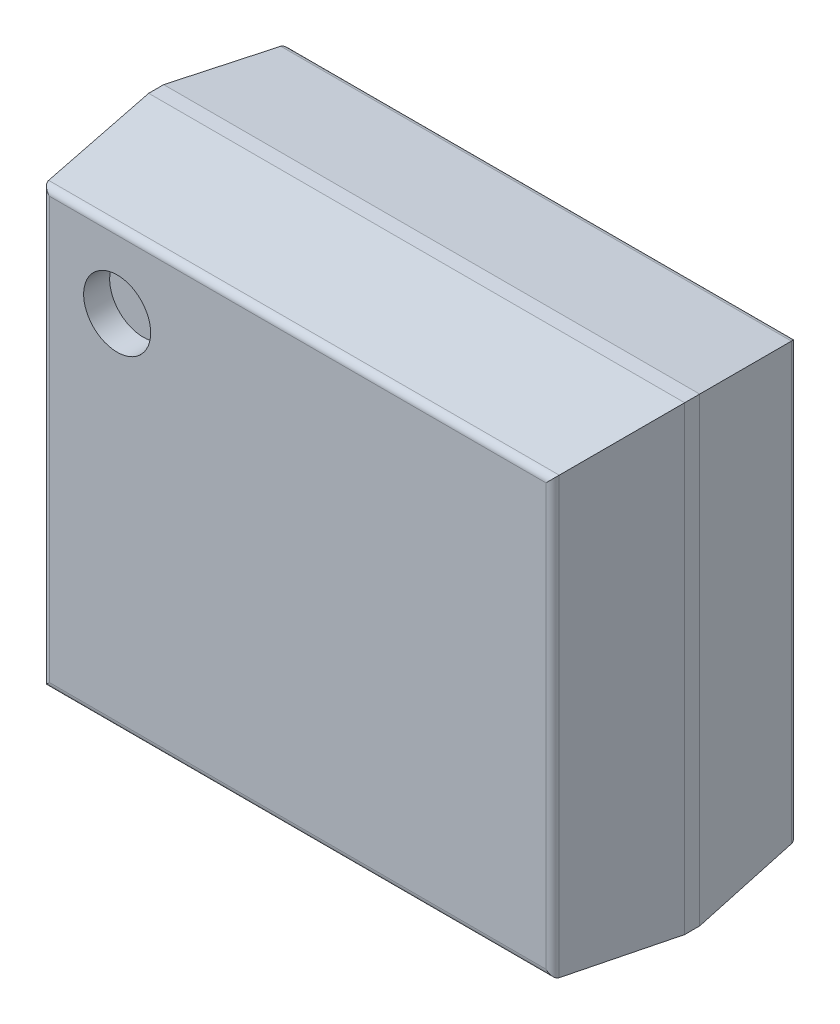
ISO-10303-21;
HEADER;
FILE_DESCRIPTION(('STEP AP214'),'2;1');
FILE_NAME('part.step','',(''),(''),'','','');
FILE_SCHEMA(('AUTOMOTIVE_DESIGN { 1 0 10303 214 1 1 1 1 }'));
ENDSEC;
DATA;
#1=APPLICATION_CONTEXT('core data for automotive mechanical design processes');
#2=APPLICATION_PROTOCOL_DEFINITION('international standard','automotive_design',2000,#1);
#3=PRODUCT_CONTEXT('',#1,'mechanical');
#4=PRODUCT('Part','Part','',(#3));
#5=PRODUCT_RELATED_PRODUCT_CATEGORY('part','',(#4));
#6=PRODUCT_DEFINITION_FORMATION('','',#4);
#7=PRODUCT_DEFINITION_CONTEXT('part definition',#1,'design');
#8=PRODUCT_DEFINITION('design','',#6,#7);
#9=PRODUCT_DEFINITION_SHAPE('','',#8);
#10=(LENGTH_UNIT() NAMED_UNIT(*) SI_UNIT(.MILLI.,.METRE.));
#11=(NAMED_UNIT(*) PLANE_ANGLE_UNIT() SI_UNIT($,.RADIAN.));
#12=(NAMED_UNIT(*) SI_UNIT($,.STERADIAN.) SOLID_ANGLE_UNIT());
#13=UNCERTAINTY_MEASURE_WITH_UNIT(LENGTH_MEASURE(1.E-05),#10,'distance_accuracy_value','');
#14=(GEOMETRIC_REPRESENTATION_CONTEXT(3) GLOBAL_UNCERTAINTY_ASSIGNED_CONTEXT((#13)) GLOBAL_UNIT_ASSIGNED_CONTEXT((#10,
#11,#12)) REPRESENTATION_CONTEXT('',''));
#15=CARTESIAN_POINT('',(0.,0.,0.));
#16=DIRECTION('',(0.,0.,1.));
#17=DIRECTION('',(1.,0.,0.));
#18=AXIS2_PLACEMENT_3D('',#15,#16,#17);
#19=CARTESIAN_POINT('',(-2.29245,1.81395,2.9763));
#20=DIRECTION('',(0.,0.,1.));
#21=DIRECTION('',(1.,0.,0.));
#22=AXIS2_PLACEMENT_3D('',#19,#20,#21);
#23=PLANE('',#22);
#24=CARTESIAN_POINT('',(-2.29245,1.81395,2.9763));
#25=DIRECTION('',(0.,0.,1.));
#26=DIRECTION('',(1.,0.,0.));
#27=AXIS2_PLACEMENT_3D('',#24,#25,#26);
#28=CIRCLE('',#27,0.4254375);
#29=CARTESIAN_POINT('',(-1.8670125,1.81395,2.9763));
#30=VERTEX_POINT('',#29);
#31=EDGE_CURVE('E11',#30,#30,#28,.T.);
#32=ORIENTED_EDGE('',*,*,#31,.T.);
#33=EDGE_LOOP('',(#32));
#34=FACE_BOUND('',#33,.T.);
#35=ADVANCED_FACE('F17',(#34),#23,.T.);
#36=CARTESIAN_POINT('',(-2.29245,1.81395,2.9763));
#37=DIRECTION('',(0.,0.,1.));
#38=DIRECTION('',(1.,0.,0.));
#39=AXIS2_PLACEMENT_3D('',#36,#37,#38);
#40=CYLINDRICAL_SURFACE('',#39,0.4254375);
#41=DIRECTION('',(0.,0.,1.));
#42=VECTOR('',#41,1.);
#43=CARTESIAN_POINT('',(-1.8670125,1.81395,2.9763));
#44=LINE('',#43,#42);
#45=CARTESIAN_POINT('',(-1.8670125,1.81395,3.307));
#46=VERTEX_POINT('',#45);
#47=EDGE_CURVE('E28',#30,#46,#44,.T.);
#48=ORIENTED_EDGE('',*,*,#47,.T.);
#49=CARTESIAN_POINT('',(-2.29245,1.81395,3.307));
#50=DIRECTION('',(0.,0.,1.));
#51=DIRECTION('',(1.,0.,0.));
#52=AXIS2_PLACEMENT_3D('',#49,#50,#51);
#53=CIRCLE('',#52,0.4254375);
#54=EDGE_CURVE('E159',#46,#46,#53,.T.);
#55=ORIENTED_EDGE('',*,*,#54,.T.);
#56=ORIENTED_EDGE('',*,*,#47,.F.);
#57=ORIENTED_EDGE('',*,*,#31,.F.);
#58=EDGE_LOOP('',(#48,#55,#56,#57));
#59=FACE_BOUND('',#58,.T.);
#60=ADVANCED_FACE('F408',(#59),#40,.F.);
#61=CARTESIAN_POINT('',(3.152888701606,-2.754825,3.217));
#62=DIRECTION('',(0.,1.,0.));
#63=DIRECTION('',(0.,0.,1.));
#64=AXIS2_PLACEMENT_3D('',#61,#62,#63);
#65=CYLINDRICAL_SURFACE('',#64,0.09);
#66=CARTESIAN_POINT('',(3.152888701606,-2.674388701606,3.217));
#67=DIRECTION('',(-0.707106781186548,-0.707106781186548,0.));
#68=DIRECTION('',(0.707106781186548,-0.707106781186548,0.));
#69=AXIS2_PLACEMENT_3D('',#66,#67,#68);
#70=ELLIPSE('',#69,0.127279220614,0.09);
#71=CARTESIAN_POINT('',(3.242323719037,-2.763823719037,3.227068647234));
#72=VERTEX_POINT('',#71);
#73=CARTESIAN_POINT('',(3.152888701606,-2.674388701606,3.307));
#74=VERTEX_POINT('',#73);
#75=EDGE_CURVE('E166',#72,#74,#70,.T.);
#76=ORIENTED_EDGE('',*,*,#75,.F.);
#77=DIRECTION('',(0.,1.,0.));
#78=VECTOR('',#77,1.);
#79=CARTESIAN_POINT('',(3.242323719037,-2.754825,3.227068647234));
#80=LINE('',#79,#78);
#81=CARTESIAN_POINT('',(3.242323719037,2.763823719037,3.227068647234));
#82=VERTEX_POINT('',#81);
#83=EDGE_CURVE('E162',#72,#82,#80,.T.);
#84=ORIENTED_EDGE('',*,*,#83,.T.);
#85=CARTESIAN_POINT('',(3.152888701606,2.674388701606,3.217));
#86=DIRECTION('',(-0.707106781186548,0.707106781186548,0.));
#87=DIRECTION('',(0.707106781186548,0.707106781186548,0.));
#88=AXIS2_PLACEMENT_3D('',#85,#86,#87);
#89=ELLIPSE('',#88,0.127279220614,0.09);
#90=CARTESIAN_POINT('',(3.152888701606,2.674388701606,3.307));
#91=VERTEX_POINT('',#90);
#92=EDGE_CURVE('E149',#91,#82,#89,.T.);
#93=ORIENTED_EDGE('',*,*,#92,.F.);
#94=DIRECTION('',(0.,1.,0.));
#95=VECTOR('',#94,1.);
#96=CARTESIAN_POINT('',(3.152888701606,-2.754825,3.307));
#97=LINE('',#96,#95);
#98=EDGE_CURVE('E196',#74,#91,#97,.T.);
#99=ORIENTED_EDGE('',*,*,#98,.F.);
#100=EDGE_LOOP('',(#76,#84,#93,#99));
#101=FACE_BOUND('',#100,.T.);
#102=ADVANCED_FACE('F164',(#101),#65,.T.);
#103=CARTESIAN_POINT('',(-3.233325,2.674388701606,3.217));
#104=DIRECTION('',(1.,0.,0.));
#105=DIRECTION('',(0.,0.,1.));
#106=AXIS2_PLACEMENT_3D('',#103,#104,#105);
#107=CYLINDRICAL_SURFACE('',#106,0.09);
#108=DIRECTION('',(1.,0.,0.));
#109=VECTOR('',#108,1.);
#110=CARTESIAN_POINT('',(-3.233325,2.674388701606,3.307));
#111=LINE('',#110,#109);
#112=CARTESIAN_POINT('',(-3.152888701606,2.674388701606,3.307));
#113=VERTEX_POINT('',#112);
#114=EDGE_CURVE('E21',#113,#91,#111,.T.);
#115=ORIENTED_EDGE('',*,*,#114,.T.);
#116=ORIENTED_EDGE('',*,*,#92,.T.);
#117=DIRECTION('',(1.,0.,0.));
#118=VECTOR('',#117,1.);
#119=CARTESIAN_POINT('',(-3.233325,2.763823719037,3.227068647234));
#120=LINE('',#119,#118);
#121=CARTESIAN_POINT('',(-3.242323719037,2.763823719037,3.227068647234));
#122=VERTEX_POINT('',#121);
#123=EDGE_CURVE('E154',#122,#82,#120,.T.);
#124=ORIENTED_EDGE('',*,*,#123,.F.);
#125=CARTESIAN_POINT('',(-3.152888701606,2.674388701606,3.217));
#126=DIRECTION('',(0.707106781186548,0.707106781186548,0.));
#127=DIRECTION('',(-0.707106781186548,0.707106781186548,0.));
#128=AXIS2_PLACEMENT_3D('',#125,#126,#127);
#129=ELLIPSE('',#128,0.127279220614,0.09);
#130=EDGE_CURVE('E185',#122,#113,#129,.T.);
#131=ORIENTED_EDGE('',*,*,#130,.T.);
#132=EDGE_LOOP('',(#115,#116,#124,#131));
#133=FACE_BOUND('',#132,.T.);
#134=ADVANCED_FACE('F151',(#133),#107,.T.);
#135=CARTESIAN_POINT('',(-3.4035,-2.925,3.307));
#136=DIRECTION('',(0.,0.,1.));
#137=DIRECTION('',(1.,0.,0.));
#138=AXIS2_PLACEMENT_3D('',#135,#136,#137);
#139=PLANE('',#138);
#140=ORIENTED_EDGE('',*,*,#54,.F.);
#141=EDGE_LOOP('',(#140));
#142=FACE_BOUND('',#141,.T.);
#143=DIRECTION('',(0.,1.,0.));
#144=VECTOR('',#143,1.);
#145=CARTESIAN_POINT('',(-3.152888701606,-2.754825,3.307));
#146=LINE('',#145,#144);
#147=CARTESIAN_POINT('',(-3.152888701606,-2.674388701606,3.307));
#148=VERTEX_POINT('',#147);
#149=EDGE_CURVE('E191',#148,#113,#146,.T.);
#150=ORIENTED_EDGE('',*,*,#149,.F.);
#151=DIRECTION('',(1.,0.,0.));
#152=VECTOR('',#151,1.);
#153=CARTESIAN_POINT('',(-3.233325,-2.674388701606,3.307));
#154=LINE('',#153,#152);
#155=EDGE_CURVE('E198',#148,#74,#154,.T.);
#156=ORIENTED_EDGE('',*,*,#155,.T.);
#157=ORIENTED_EDGE('',*,*,#98,.T.);
#158=ORIENTED_EDGE('',*,*,#114,.F.);
#159=EDGE_LOOP('',(#150,#156,#157,#158));
#160=FACE_BOUND('',#159,.T.);
#161=ADVANCED_FACE('F388',(#142,#160),#139,.T.);
#162=CARTESIAN_POINT('',(-3.233325,-2.674388701606,3.217));
#163=DIRECTION('',(1.,0.,0.));
#164=DIRECTION('',(0.,-0.993722415899916,0.11187385815299));
#165=AXIS2_PLACEMENT_3D('',#162,#163,#164);
#166=CYLINDRICAL_SURFACE('',#165,0.09);
#167=DIRECTION('',(1.,0.,0.));
#168=VECTOR('',#167,1.);
#169=CARTESIAN_POINT('',(-3.233325,-2.763823719037,3.227068647234));
#170=LINE('',#169,#168);
#171=CARTESIAN_POINT('',(-3.242323719037,-2.763823719037,3.227068647234));
#172=VERTEX_POINT('',#171);
#173=EDGE_CURVE('E249',#172,#72,#170,.T.);
#174=ORIENTED_EDGE('',*,*,#173,.T.);
#175=ORIENTED_EDGE('',*,*,#75,.T.);
#176=ORIENTED_EDGE('',*,*,#155,.F.);
#177=CARTESIAN_POINT('',(-3.152888701606,-2.674388701606,3.217));
#178=DIRECTION('',(-0.707106781186548,0.707106781186548,0.));
#179=DIRECTION('',(0.707106781186548,0.707106781186548,0.));
#180=AXIS2_PLACEMENT_3D('',#177,#178,#179);
#181=ELLIPSE('',#180,0.127279220614,0.09);
#182=EDGE_CURVE('E251',#172,#148,#181,.T.);
#183=ORIENTED_EDGE('',*,*,#182,.F.);
#184=EDGE_LOOP('',(#174,#175,#176,#183));
#185=FACE_BOUND('',#184,.T.);
#186=ADVANCED_FACE('F385',(#185),#166,.T.);
#187=CARTESIAN_POINT('',(3.3184125,-2.925,2.551208097772));
#188=DIRECTION('',(0.993722415899916,0.,0.11187385815299));
#189=DIRECTION('',(0.,-1.,0.));
#190=AXIS2_PLACEMENT_3D('',#187,#188,#189);
#191=PLANE('',#190);
#192=DIRECTION('',(-0.111180268816051,0.111180268816051,0.987561590814457));
#193=VECTOR('',#192,1.);
#194=CARTESIAN_POINT('',(3.277393429953,-2.798893429953,2.915561040079));
#195=LINE('',#194,#193);
#196=CARTESIAN_POINT('',(3.4035,-2.925,1.795416195544));
#197=VERTEX_POINT('',#196);
#198=EDGE_CURVE('E225',#197,#72,#195,.T.);
#199=ORIENTED_EDGE('',*,*,#198,.F.);
#200=DIRECTION('',(0.,1.,0.));
#201=VECTOR('',#200,1.);
#202=CARTESIAN_POINT('',(3.4035,-2.925,1.795416195544));
#203=LINE('',#202,#201);
#204=CARTESIAN_POINT('',(3.4035,2.925,1.795416195544));
#205=VERTEX_POINT('',#204);
#206=EDGE_CURVE('E174',#197,#205,#203,.T.);
#207=ORIENTED_EDGE('',*,*,#206,.T.);
#208=DIRECTION('',(-0.111180268816051,-0.111180268816051,0.987561590814457));
#209=VECTOR('',#208,1.);
#210=CARTESIAN_POINT('',(3.241237352344,2.762737352344,3.23671832726));
#211=LINE('',#210,#209);
#212=EDGE_CURVE('E170',#205,#82,#211,.T.);
#213=ORIENTED_EDGE('',*,*,#212,.T.);
#214=ORIENTED_EDGE('',*,*,#83,.F.);
#215=EDGE_LOOP('',(#199,#207,#213,#214));
#216=FACE_BOUND('',#215,.T.);
#217=ADVANCED_FACE('F19',(#216),#191,.T.);
#218=CARTESIAN_POINT('',(-3.4035,2.8399125,2.551208097772));
#219=DIRECTION('',(0.,0.993722415899916,0.11187385815299));
#220=DIRECTION('',(1.,0.,0.));
#221=AXIS2_PLACEMENT_3D('',#218,#219,#220);
#222=PLANE('',#221);
#223=ORIENTED_EDGE('',*,*,#123,.T.);
#224=ORIENTED_EDGE('',*,*,#212,.F.);
#225=DIRECTION('',(1.,0.,0.));
#226=VECTOR('',#225,1.);
#227=CARTESIAN_POINT('',(-3.4035,2.925,1.795416195544));
#228=LINE('',#227,#226);
#229=CARTESIAN_POINT('',(-3.4035,2.925,1.795416195544));
#230=VERTEX_POINT('',#229);
#231=EDGE_CURVE('E265',#230,#205,#228,.T.);
#232=ORIENTED_EDGE('',*,*,#231,.F.);
#233=DIRECTION('',(0.111180268816051,-0.111180268816051,0.987561590814457));
#234=VECTOR('',#233,1.);
#235=CARTESIAN_POINT('',(-3.283308193418,2.804808193418,2.863023001817));
#236=LINE('',#235,#234);
#237=EDGE_CURVE('E182',#230,#122,#236,.T.);
#238=ORIENTED_EDGE('',*,*,#237,.T.);
#239=EDGE_LOOP('',(#223,#224,#232,#238));
#240=FACE_BOUND('',#239,.T.);
#241=ADVANCED_FACE('F180',(#240),#222,.T.);
#242=CARTESIAN_POINT('',(-3.152888701606,-2.754825,3.217));
#243=DIRECTION('',(0.,1.,0.));
#244=DIRECTION('',(-0.993722415899916,0.,0.11187385815299));
#245=AXIS2_PLACEMENT_3D('',#242,#243,#244);
#246=CYLINDRICAL_SURFACE('',#245,0.09);
#247=ORIENTED_EDGE('',*,*,#182,.T.);
#248=ORIENTED_EDGE('',*,*,#149,.T.);
#249=ORIENTED_EDGE('',*,*,#130,.F.);
#250=DIRECTION('',(0.,1.,0.));
#251=VECTOR('',#250,1.);
#252=CARTESIAN_POINT('',(-3.242323719037,-2.754825,3.227068647234));
#253=LINE('',#252,#251);
#254=EDGE_CURVE('E280',#172,#122,#253,.T.);
#255=ORIENTED_EDGE('',*,*,#254,.F.);
#256=EDGE_LOOP('',(#247,#248,#249,#255));
#257=FACE_BOUND('',#256,.T.);
#258=ADVANCED_FACE('F390',(#257),#246,.T.);
#259=CARTESIAN_POINT('',(-3.4035,-2.8399125,2.551208097772));
#260=DIRECTION('',(0.,0.993722415899916,-0.11187385815299));
#261=DIRECTION('',(-1.,0.,0.));
#262=AXIS2_PLACEMENT_3D('',#259,#260,#261);
#263=PLANE('',#262);
#264=DIRECTION('',(0.111180268816051,0.111180268816051,0.987561590814457));
#265=VECTOR('',#264,1.);
#266=CARTESIAN_POINT('',(-3.319464271027,-2.840964271027,2.541865714636));
#267=LINE('',#266,#265);
#268=CARTESIAN_POINT('',(-3.4035,-2.925,1.795416195544));
#269=VERTEX_POINT('',#268);
#270=EDGE_CURVE('E298',#269,#172,#267,.T.);
#271=ORIENTED_EDGE('',*,*,#270,.F.);
#272=DIRECTION('',(1.,0.,0.));
#273=VECTOR('',#272,1.);
#274=CARTESIAN_POINT('',(-3.4035,-2.925,1.795416195544));
#275=LINE('',#274,#273);
#276=EDGE_CURVE('E305',#269,#197,#275,.T.);
#277=ORIENTED_EDGE('',*,*,#276,.T.);
#278=ORIENTED_EDGE('',*,*,#198,.T.);
#279=ORIENTED_EDGE('',*,*,#173,.F.);
#280=EDGE_LOOP('',(#271,#277,#278,#279));
#281=FACE_BOUND('',#280,.T.);
#282=ADVANCED_FACE('F396',(#281),#263,.F.);
#283=CARTESIAN_POINT('',(3.4035,-2.925,0.2));
#284=DIRECTION('',(1.,0.,0.));
#285=DIRECTION('',(0.,1.,0.));
#286=AXIS2_PLACEMENT_3D('',#283,#284,#285);
#287=PLANE('',#286);
#288=DIRECTION('',(0.,0.,1.));
#289=VECTOR('',#288,1.);
#290=CARTESIAN_POINT('',(3.4035,-2.925,0.2));
#291=LINE('',#290,#289);
#292=CARTESIAN_POINT('',(3.4035,-2.925,1.604916195544));
#293=VERTEX_POINT('',#292);
#294=EDGE_CURVE('E291',#293,#197,#291,.T.);
#295=ORIENTED_EDGE('',*,*,#294,.F.);
#296=DIRECTION('',(0.,1.,0.));
#297=VECTOR('',#296,1.);
#298=CARTESIAN_POINT('',(3.4035,-2.925,1.604916195544));
#299=LINE('',#298,#297);
#300=CARTESIAN_POINT('',(3.4035,2.925,1.604916195544));
#301=VERTEX_POINT('',#300);
#302=EDGE_CURVE('E290',#293,#301,#299,.T.);
#303=ORIENTED_EDGE('',*,*,#302,.T.);
#304=DIRECTION('',(0.,0.,1.));
#305=VECTOR('',#304,1.);
#306=CARTESIAN_POINT('',(3.4035,2.925,0.2));
#307=LINE('',#306,#305);
#308=EDGE_CURVE('E271',#301,#205,#307,.T.);
#309=ORIENTED_EDGE('',*,*,#308,.T.);
#310=ORIENTED_EDGE('',*,*,#206,.F.);
#311=EDGE_LOOP('',(#295,#303,#309,#310));
#312=FACE_BOUND('',#311,.T.);
#313=ADVANCED_FACE('F374',(#312),#287,.T.);
#314=CARTESIAN_POINT('',(3.153568702027,-2.754825,0.29));
#315=DIRECTION('',(0.,1.,0.));
#316=DIRECTION('',(0.,0.,-1.));
#317=AXIS2_PLACEMENT_3D('',#314,#315,#316);
#318=CYLINDRICAL_SURFACE('',#317,0.09);
#319=DIRECTION('',(0.,1.,0.));
#320=VECTOR('',#319,1.);
#321=CARTESIAN_POINT('',(3.153568702027,-2.754825,0.2));
#322=LINE('',#321,#320);
#323=CARTESIAN_POINT('',(3.153568702027,-2.675068702027,0.2));
#324=VERTEX_POINT('',#323);
#325=CARTESIAN_POINT('',(3.153568702027,2.675068702027,0.2));
#326=VERTEX_POINT('',#325);
#327=EDGE_CURVE('E293',#324,#326,#322,.T.);
#328=ORIENTED_EDGE('',*,*,#327,.T.);
#329=CARTESIAN_POINT('',(3.153568702027,2.675068702027,0.29));
#330=DIRECTION('',(0.707106781186548,-0.707106781186548,0.));
#331=DIRECTION('',(0.707106781186548,0.707106781186548,0.));
#332=AXIS2_PLACEMENT_3D('',#329,#330,#331);
#333=ELLIPSE('',#332,0.127279220614,0.09);
#334=CARTESIAN_POINT('',(3.242915637577,2.764415637577,0.279177564608));
#335=VERTEX_POINT('',#334);
#336=EDGE_CURVE('E283',#326,#335,#333,.T.);
#337=ORIENTED_EDGE('',*,*,#336,.T.);
#338=DIRECTION('',(0.,1.,0.));
#339=VECTOR('',#338,1.);
#340=CARTESIAN_POINT('',(3.242915637577,-2.754825,0.279177564608));
#341=LINE('',#340,#339);
#342=CARTESIAN_POINT('',(3.242915637577,-2.764415637577,0.279177564608));
#343=VERTEX_POINT('',#342);
#344=EDGE_CURVE('E287',#343,#335,#341,.T.);
#345=ORIENTED_EDGE('',*,*,#344,.F.);
#346=CARTESIAN_POINT('',(3.153568702027,-2.675068702027,0.29));
#347=DIRECTION('',(0.707106781186548,0.707106781186548,0.));
#348=DIRECTION('',(0.707106781186548,-0.707106781186548,0.));
#349=AXIS2_PLACEMENT_3D('',#346,#347,#348);
#350=ELLIPSE('',#349,0.127279220614,0.09);
#351=EDGE_CURVE('E311',#343,#324,#350,.T.);
#352=ORIENTED_EDGE('',*,*,#351,.T.);
#353=EDGE_LOOP('',(#328,#337,#345,#352));
#354=FACE_BOUND('',#353,.T.);
#355=ADVANCED_FACE('F362',(#354),#318,.T.);
#356=CARTESIAN_POINT('',(-3.4035,2.925,0.2));
#357=DIRECTION('',(0.,1.,0.));
#358=DIRECTION('',(1.,0.,0.));
#359=AXIS2_PLACEMENT_3D('',#356,#357,#358);
#360=PLANE('',#359);
#361=ORIENTED_EDGE('',*,*,#308,.F.);
#362=DIRECTION('',(1.,0.,0.));
#363=VECTOR('',#362,1.);
#364=CARTESIAN_POINT('',(-3.4035,2.925,1.604916195544));
#365=LINE('',#364,#363);
#366=CARTESIAN_POINT('',(-3.4035,2.925,1.604916195544));
#367=VERTEX_POINT('',#366);
#368=EDGE_CURVE('E104',#367,#301,#365,.T.);
#369=ORIENTED_EDGE('',*,*,#368,.F.);
#370=DIRECTION('',(0.,0.,1.));
#371=VECTOR('',#370,1.);
#372=CARTESIAN_POINT('',(-3.4035,2.925,0.2));
#373=LINE('',#372,#371);
#374=EDGE_CURVE('E204',#367,#230,#373,.T.);
#375=ORIENTED_EDGE('',*,*,#374,.T.);
#376=ORIENTED_EDGE('',*,*,#231,.T.);
#377=EDGE_LOOP('',(#361,#369,#375,#376));
#378=FACE_BOUND('',#377,.T.);
#379=ADVANCED_FACE('F372',(#378),#360,.T.);
#380=CARTESIAN_POINT('',(-3.3184125,-2.925,2.551208097772));
#381=DIRECTION('',(0.993722415899916,0.,-0.11187385815299));
#382=DIRECTION('',(0.,-1.,0.));
#383=AXIS2_PLACEMENT_3D('',#380,#381,#382);
#384=PLANE('',#383);
#385=ORIENTED_EDGE('',*,*,#254,.T.);
#386=ORIENTED_EDGE('',*,*,#237,.F.);
#387=DIRECTION('',(0.,1.,0.));
#388=VECTOR('',#387,1.);
#389=CARTESIAN_POINT('',(-3.4035,-2.925,1.795416195544));
#390=LINE('',#389,#388);
#391=EDGE_CURVE('E215',#269,#230,#390,.T.);
#392=ORIENTED_EDGE('',*,*,#391,.F.);
#393=ORIENTED_EDGE('',*,*,#270,.T.);
#394=EDGE_LOOP('',(#385,#386,#392,#393));
#395=FACE_BOUND('',#394,.T.);
#396=ADVANCED_FACE('F378',(#395),#384,.F.);
#397=CARTESIAN_POINT('',(-3.233325,2.675068702027,0.29));
#398=DIRECTION('',(1.,0.,0.));
#399=DIRECTION('',(0.,0.,-1.));
#400=AXIS2_PLACEMENT_3D('',#397,#398,#399);
#401=CYLINDRICAL_SURFACE('',#400,0.09);
#402=CARTESIAN_POINT('',(-3.153568702027,2.675068702027,0.29));
#403=DIRECTION('',(-0.707106781186548,-0.707106781186548,0.));
#404=DIRECTION('',(-0.707106781186548,0.707106781186548,0.));
#405=AXIS2_PLACEMENT_3D('',#402,#403,#404);
#406=ELLIPSE('',#405,0.127279220614,0.09);
#407=CARTESIAN_POINT('',(-3.242915637577,2.764415637577,0.279177564608));
#408=VERTEX_POINT('',#407);
#409=CARTESIAN_POINT('',(-3.153568702027,2.675068702027,0.2));
#410=VERTEX_POINT('',#409);
#411=EDGE_CURVE('E241',#408,#410,#406,.T.);
#412=ORIENTED_EDGE('',*,*,#411,.F.);
#413=DIRECTION('',(1.,0.,0.));
#414=VECTOR('',#413,1.);
#415=CARTESIAN_POINT('',(-3.233325,2.764415637577,0.279177564608));
#416=LINE('',#415,#414);
#417=EDGE_CURVE('E92',#408,#335,#416,.T.);
#418=ORIENTED_EDGE('',*,*,#417,.T.);
#419=ORIENTED_EDGE('',*,*,#336,.F.);
#420=DIRECTION('',(1.,0.,0.));
#421=VECTOR('',#420,1.);
#422=CARTESIAN_POINT('',(-3.233325,2.675068702027,0.2));
#423=LINE('',#422,#421);
#424=EDGE_CURVE('E297',#410,#326,#423,.T.);
#425=ORIENTED_EDGE('',*,*,#424,.F.);
#426=EDGE_LOOP('',(#412,#418,#419,#425));
#427=FACE_BOUND('',#426,.T.);
#428=ADVANCED_FACE('F367',(#427),#401,.T.);
#429=CARTESIAN_POINT('',(-3.4035,-2.925,0.2));
#430=DIRECTION('',(0.,0.,1.));
#431=DIRECTION('',(1.,0.,0.));
#432=AXIS2_PLACEMENT_3D('',#429,#430,#431);
#433=PLANE('',#432);
#434=ORIENTED_EDGE('',*,*,#424,.T.);
#435=ORIENTED_EDGE('',*,*,#327,.F.);
#436=DIRECTION('',(1.,0.,0.));
#437=VECTOR('',#436,1.);
#438=CARTESIAN_POINT('',(-3.233325,-2.675068702027,0.2));
#439=LINE('',#438,#437);
#440=CARTESIAN_POINT('',(-3.153568702027,-2.675068702027,0.2));
#441=VERTEX_POINT('',#440);
#442=EDGE_CURVE('E316',#441,#324,#439,.T.);
#443=ORIENTED_EDGE('',*,*,#442,.F.);
#444=DIRECTION('',(0.,1.,0.));
#445=VECTOR('',#444,1.);
#446=CARTESIAN_POINT('',(-3.153568702027,-2.754825,0.2));
#447=LINE('',#446,#445);
#448=EDGE_CURVE('E237',#441,#410,#447,.T.);
#449=ORIENTED_EDGE('',*,*,#448,.T.);
#450=EDGE_LOOP('',(#434,#435,#443,#449));
#451=FACE_BOUND('',#450,.T.);
#452=ADVANCED_FACE('F360',(#451),#433,.F.);
#453=CARTESIAN_POINT('',(3.3184125,-2.925,0.902458097772));
#454=DIRECTION('',(-0.992743728334123,0.,0.120249282132015));
#455=DIRECTION('',(0.,1.,0.));
#456=AXIS2_PLACEMENT_3D('',#453,#454,#455);
#457=PLANE('',#456);
#458=ORIENTED_EDGE('',*,*,#344,.T.);
#459=DIRECTION('',(-0.119389202775043,-0.119389202775043,-0.985643158816354));
#460=VECTOR('',#459,1.);
#461=CARTESIAN_POINT('',(3.229420260917,2.750920260917,0.167763589381));
#462=LINE('',#461,#460);
#463=EDGE_CURVE('E212',#301,#335,#462,.T.);
#464=ORIENTED_EDGE('',*,*,#463,.F.);
#465=ORIENTED_EDGE('',*,*,#302,.F.);
#466=DIRECTION('',(-0.119389202775043,0.119389202775043,-0.985643158816354));
#467=VECTOR('',#466,1.);
#468=CARTESIAN_POINT('',(3.271112572504,-2.792612572504,0.511963405915));
#469=LINE('',#468,#467);
#470=EDGE_CURVE('E279',#293,#343,#469,.T.);
#471=ORIENTED_EDGE('',*,*,#470,.T.);
#472=EDGE_LOOP('',(#458,#464,#465,#471));
#473=FACE_BOUND('',#472,.T.);
#474=ADVANCED_FACE('F365',(#473),#457,.F.);
#475=CARTESIAN_POINT('',(-3.4035,-2.925,0.2));
#476=DIRECTION('',(0.,1.,0.));
#477=DIRECTION('',(1.,0.,0.));
#478=AXIS2_PLACEMENT_3D('',#475,#476,#477);
#479=PLANE('',#478);
#480=ORIENTED_EDGE('',*,*,#276,.F.);
#481=DIRECTION('',(0.,0.,1.));
#482=VECTOR('',#481,1.);
#483=CARTESIAN_POINT('',(-3.4035,-2.925,0.2));
#484=LINE('',#483,#482);
#485=CARTESIAN_POINT('',(-3.4035,-2.925,1.604916195544));
#486=VERTEX_POINT('',#485);
#487=EDGE_CURVE('E201',#486,#269,#484,.T.);
#488=ORIENTED_EDGE('',*,*,#487,.F.);
#489=DIRECTION('',(1.,0.,0.));
#490=VECTOR('',#489,1.);
#491=CARTESIAN_POINT('',(-3.4035,-2.925,1.604916195544));
#492=LINE('',#491,#490);
#493=EDGE_CURVE('E276',#486,#293,#492,.T.);
#494=ORIENTED_EDGE('',*,*,#493,.T.);
#495=ORIENTED_EDGE('',*,*,#294,.T.);
#496=EDGE_LOOP('',(#480,#488,#494,#495));
#497=FACE_BOUND('',#496,.T.);
#498=ADVANCED_FACE('F375',(#497),#479,.F.);
#499=CARTESIAN_POINT('',(-3.233325,-2.675068702027,0.29));
#500=DIRECTION('',(1.,0.,0.));
#501=DIRECTION('',(0.,-0.992743728334123,-0.120249282132015));
#502=AXIS2_PLACEMENT_3D('',#499,#500,#501);
#503=CYLINDRICAL_SURFACE('',#502,0.09);
#504=CARTESIAN_POINT('',(-3.153568702027,-2.675068702027,0.29));
#505=DIRECTION('',(0.707106781186548,-0.707106781186548,0.));
#506=DIRECTION('',(0.707106781186548,0.707106781186548,0.));
#507=AXIS2_PLACEMENT_3D('',#504,#505,#506);
#508=ELLIPSE('',#507,0.127279220614,0.09);
#509=CARTESIAN_POINT('',(-3.242915637577,-2.764415637577,0.279177564608));
#510=VERTEX_POINT('',#509);
#511=EDGE_CURVE('E221',#510,#441,#508,.T.);
#512=ORIENTED_EDGE('',*,*,#511,.T.);
#513=ORIENTED_EDGE('',*,*,#442,.T.);
#514=ORIENTED_EDGE('',*,*,#351,.F.);
#515=DIRECTION('',(1.,0.,0.));
#516=VECTOR('',#515,1.);
#517=CARTESIAN_POINT('',(-3.233325,-2.764415637577,0.279177564608));
#518=LINE('',#517,#516);
#519=EDGE_CURVE('E248',#510,#343,#518,.T.);
#520=ORIENTED_EDGE('',*,*,#519,.F.);
#521=EDGE_LOOP('',(#512,#513,#514,#520));
#522=FACE_BOUND('',#521,.T.);
#523=ADVANCED_FACE('F353',(#522),#503,.T.);
#524=CARTESIAN_POINT('',(-3.4035,2.8399125,0.902458097772));
#525=DIRECTION('',(0.,-0.992743728334123,0.120249282132015));
#526=DIRECTION('',(-1.,0.,0.));
#527=AXIS2_PLACEMENT_3D('',#524,#525,#526);
#528=PLANE('',#527);
#529=DIRECTION('',(0.119389202775043,-0.119389202775043,-0.985643158816354));
#530=VECTOR('',#529,1.);
#531=CARTESIAN_POINT('',(-3.277933007066,2.799433007066,0.568270965645));
#532=LINE('',#531,#530);
#533=EDGE_CURVE('E228',#367,#408,#532,.T.);
#534=ORIENTED_EDGE('',*,*,#533,.F.);
#535=ORIENTED_EDGE('',*,*,#368,.T.);
#536=ORIENTED_EDGE('',*,*,#463,.T.);
#537=ORIENTED_EDGE('',*,*,#417,.F.);
#538=EDGE_LOOP('',(#534,#535,#536,#537));
#539=FACE_BOUND('',#538,.T.);
#540=ADVANCED_FACE('F368',(#539),#528,.F.);
#541=CARTESIAN_POINT('',(-3.4035,-2.925,0.2));
#542=DIRECTION('',(1.,0.,0.));
#543=DIRECTION('',(0.,1.,0.));
#544=AXIS2_PLACEMENT_3D('',#541,#542,#543);
#545=PLANE('',#544);
#546=ORIENTED_EDGE('',*,*,#391,.T.);
#547=ORIENTED_EDGE('',*,*,#374,.F.);
#548=DIRECTION('',(0.,1.,0.));
#549=VECTOR('',#548,1.);
#550=CARTESIAN_POINT('',(-3.4035,-2.925,1.604916195544));
#551=LINE('',#550,#549);
#552=EDGE_CURVE('E233',#486,#367,#551,.T.);
#553=ORIENTED_EDGE('',*,*,#552,.F.);
#554=ORIENTED_EDGE('',*,*,#487,.T.);
#555=EDGE_LOOP('',(#546,#547,#553,#554));
#556=FACE_BOUND('',#555,.T.);
#557=ADVANCED_FACE('F376',(#556),#545,.F.);
#558=CARTESIAN_POINT('',(-3.153568702027,-2.754825,0.29));
#559=DIRECTION('',(0.,1.,0.));
#560=DIRECTION('',(-0.992743728334123,0.,-0.120249282132015));
#561=AXIS2_PLACEMENT_3D('',#558,#559,#560);
#562=CYLINDRICAL_SURFACE('',#561,0.09);
#563=DIRECTION('',(0.,1.,0.));
#564=VECTOR('',#563,1.);
#565=CARTESIAN_POINT('',(-3.242915637577,-2.754825,0.279177564608));
#566=LINE('',#565,#564);
#567=EDGE_CURVE('E232',#510,#408,#566,.T.);
#568=ORIENTED_EDGE('',*,*,#567,.T.);
#569=ORIENTED_EDGE('',*,*,#411,.T.);
#570=ORIENTED_EDGE('',*,*,#448,.F.);
#571=ORIENTED_EDGE('',*,*,#511,.F.);
#572=EDGE_LOOP('',(#568,#569,#570,#571));
#573=FACE_BOUND('',#572,.T.);
#574=ADVANCED_FACE('F358',(#573),#562,.T.);
#575=CARTESIAN_POINT('',(-3.4035,-2.8399125,0.902458097772));
#576=DIRECTION('',(0.,-0.992743728334123,-0.120249282132015));
#577=DIRECTION('',(0.,0.120249282132015,-0.992743728334123));
#578=AXIS2_PLACEMENT_3D('',#575,#576,#577);
#579=PLANE('',#578);
#580=ORIENTED_EDGE('',*,*,#519,.T.);
#581=ORIENTED_EDGE('',*,*,#470,.F.);
#582=ORIENTED_EDGE('',*,*,#493,.F.);
#583=DIRECTION('',(0.119389202775043,0.119389202775043,-0.985643158816354));
#584=VECTOR('',#583,1.);
#585=CARTESIAN_POINT('',(-3.319625318654,-2.841125318654,0.912470782179));
#586=LINE('',#585,#584);
#587=EDGE_CURVE('E245',#486,#510,#586,.T.);
#588=ORIENTED_EDGE('',*,*,#587,.T.);
#589=EDGE_LOOP('',(#580,#581,#582,#588));
#590=FACE_BOUND('',#589,.T.);
#591=ADVANCED_FACE('F347',(#590),#579,.T.);
#592=CARTESIAN_POINT('',(-3.3184125,-2.925,0.902458097772));
#593=DIRECTION('',(-0.992743728334123,0.,-0.120249282132015));
#594=DIRECTION('',(-0.120249282132015,0.,0.992743728334123));
#595=AXIS2_PLACEMENT_3D('',#592,#593,#594);
#596=PLANE('',#595);
#597=ORIENTED_EDGE('',*,*,#587,.F.);
#598=ORIENTED_EDGE('',*,*,#552,.T.);
#599=ORIENTED_EDGE('',*,*,#533,.T.);
#600=ORIENTED_EDGE('',*,*,#567,.F.);
#601=EDGE_LOOP('',(#597,#598,#599,#600));
#602=FACE_BOUND('',#601,.T.);
#603=ADVANCED_FACE('F356',(#602),#596,.T.);
#604=CLOSED_SHELL('',(#35,#60,#102,#134,#161,#186,#217,#241,#258,#282,#313,#355,#379,#396,#428,
#452,#474,#498,#523,#540,#557,#574,#591,#603));
#605=MANIFOLD_SOLID_BREP('B1',#604);
#606=ADVANCED_BREP_SHAPE_REPRESENTATION('',(#18,#605),#14);
#607=SHAPE_DEFINITION_REPRESENTATION(#9,#606);
ENDSEC;
END-ISO-10303-21;
